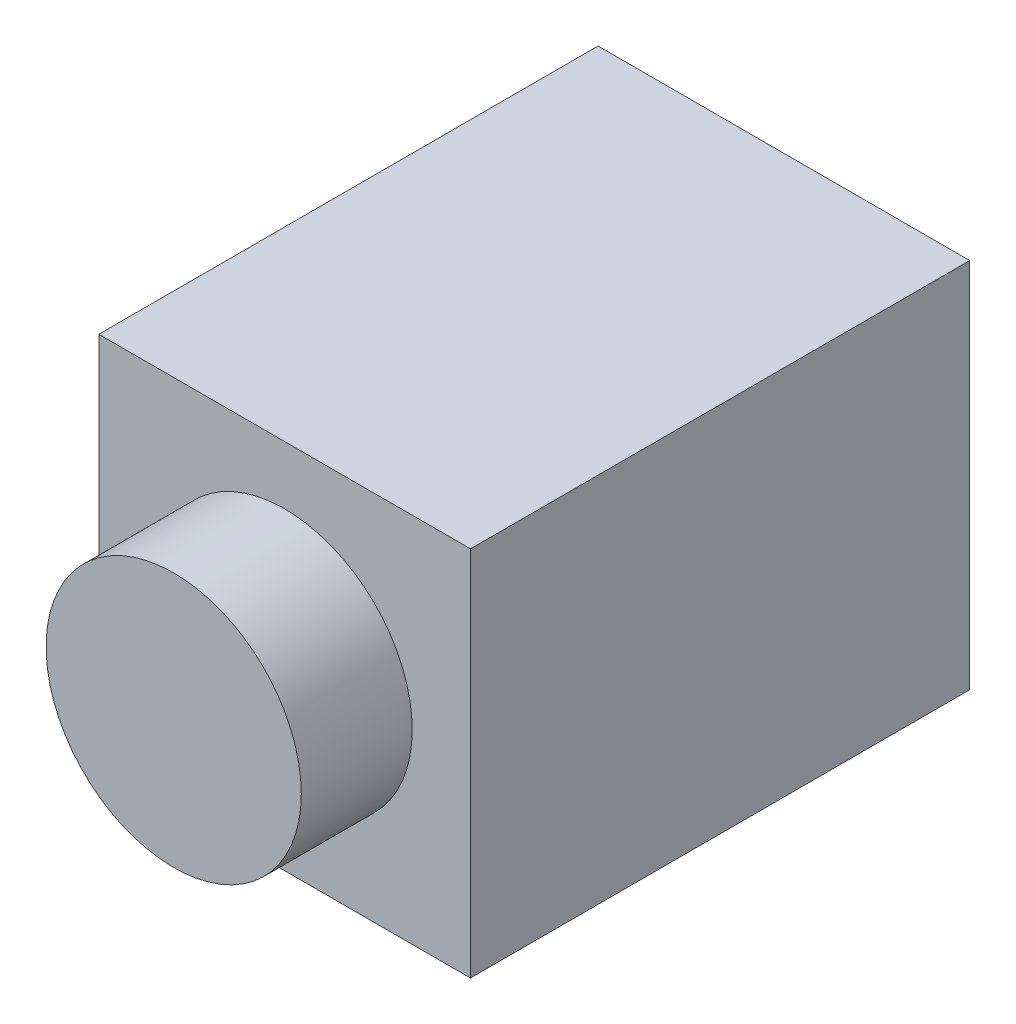
ISO-10303-21;
HEADER;
FILE_DESCRIPTION(('STEP AP214'),'2;1');
FILE_NAME('part.step','',(''),(''),'','','');
FILE_SCHEMA(('AUTOMOTIVE_DESIGN { 1 0 10303 214 1 1 1 1 }'));
ENDSEC;
DATA;
#1=APPLICATION_CONTEXT('core data for automotive mechanical design processes');
#2=APPLICATION_PROTOCOL_DEFINITION('international standard','automotive_design',2000,#1);
#3=PRODUCT_CONTEXT('',#1,'mechanical');
#4=PRODUCT('Part','Part','',(#3));
#5=PRODUCT_RELATED_PRODUCT_CATEGORY('part','',(#4));
#6=PRODUCT_DEFINITION_FORMATION('','',#4);
#7=PRODUCT_DEFINITION_CONTEXT('part definition',#1,'design');
#8=PRODUCT_DEFINITION('design','',#6,#7);
#9=PRODUCT_DEFINITION_SHAPE('','',#8);
#10=(LENGTH_UNIT() NAMED_UNIT(*) SI_UNIT(.MILLI.,.METRE.));
#11=(NAMED_UNIT(*) PLANE_ANGLE_UNIT() SI_UNIT($,.RADIAN.));
#12=(NAMED_UNIT(*) SI_UNIT($,.STERADIAN.) SOLID_ANGLE_UNIT());
#13=UNCERTAINTY_MEASURE_WITH_UNIT(LENGTH_MEASURE(1.E-05),#10,'distance_accuracy_value','');
#14=(GEOMETRIC_REPRESENTATION_CONTEXT(3) GLOBAL_UNCERTAINTY_ASSIGNED_CONTEXT((#13)) GLOBAL_UNIT_ASSIGNED_CONTEXT((#10,
#11,#12)) REPRESENTATION_CONTEXT('',''));
#15=CARTESIAN_POINT('',(0.,0.,0.));
#16=DIRECTION('',(0.,0.,1.));
#17=DIRECTION('',(1.,0.,0.));
#18=AXIS2_PLACEMENT_3D('',#15,#16,#17);
#19=CARTESIAN_POINT('',(33.5,33.5,110.));
#20=DIRECTION('',(0.,0.,-1.));
#21=DIRECTION('',(-1.,0.,0.));
#22=AXIS2_PLACEMENT_3D('',#19,#20,#21);
#23=PLANE('',#22);
#24=CARTESIAN_POINT('',(33.5,33.5,110.));
#25=DIRECTION('',(0.,0.,1.));
#26=DIRECTION('',(1.,0.,0.));
#27=AXIS2_PLACEMENT_3D('',#24,#25,#26);
#28=CIRCLE('',#27,23.);
#29=CARTESIAN_POINT('',(56.5,33.5,110.));
#30=VERTEX_POINT('',#29);
#31=EDGE_CURVE('E69',#30,#30,#28,.F.);
#32=ORIENTED_EDGE('',*,*,#31,.F.);
#33=EDGE_LOOP('',(#32));
#34=FACE_BOUND('',#33,.T.);
#35=ADVANCED_FACE('F17',(#34),#23,.F.);
#36=CARTESIAN_POINT('',(33.5,33.5,90.));
#37=DIRECTION('',(0.,0.,1.));
#38=DIRECTION('',(1.,0.,0.));
#39=AXIS2_PLACEMENT_3D('',#36,#37,#38);
#40=CYLINDRICAL_SURFACE('',#39,23.);
#41=CARTESIAN_POINT('',(33.5,33.5,90.));
#42=DIRECTION('',(0.,0.,1.));
#43=DIRECTION('',(1.,0.,0.));
#44=AXIS2_PLACEMENT_3D('',#41,#42,#43);
#45=CIRCLE('',#44,23.);
#46=CARTESIAN_POINT('',(56.5,33.5,90.));
#47=VERTEX_POINT('',#46);
#48=EDGE_CURVE('E68',#47,#47,#45,.F.);
#49=ORIENTED_EDGE('',*,*,#48,.F.);
#50=EDGE_LOOP('',(#49));
#51=FACE_BOUND('',#50,.T.);
#52=ORIENTED_EDGE('',*,*,#31,.T.);
#53=EDGE_LOOP('',(#52));
#54=FACE_BOUND('',#53,.T.);
#55=ADVANCED_FACE('F89',(#51,#54),#40,.T.);
#56=CARTESIAN_POINT('',(67.,67.,0.));
#57=DIRECTION('',(1.,0.,0.));
#58=DIRECTION('',(0.,0.,-1.));
#59=AXIS2_PLACEMENT_3D('',#56,#57,#58);
#60=PLANE('',#59);
#61=DIRECTION('',(0.,1.,0.));
#62=VECTOR('',#61,1.);
#63=CARTESIAN_POINT('',(67.,33.5,0.));
#64=LINE('',#63,#62);
#65=CARTESIAN_POINT('',(67.,0.,0.));
#66=VERTEX_POINT('',#65);
#67=CARTESIAN_POINT('',(67.,67.,0.));
#68=VERTEX_POINT('',#67);
#69=EDGE_CURVE('E55',#66,#68,#64,.T.);
#70=ORIENTED_EDGE('',*,*,#69,.T.);
#71=DIRECTION('',(0.,0.,1.));
#72=VECTOR('',#71,1.);
#73=CARTESIAN_POINT('',(67.,67.,0.));
#74=LINE('',#73,#72);
#75=CARTESIAN_POINT('',(67.,67.,90.));
#76=VERTEX_POINT('',#75);
#77=EDGE_CURVE('E71',#76,#68,#74,.F.);
#78=ORIENTED_EDGE('',*,*,#77,.F.);
#79=DIRECTION('',(0.,1.,0.));
#80=VECTOR('',#79,1.);
#81=CARTESIAN_POINT('',(67.,33.5,90.));
#82=LINE('',#81,#80);
#83=CARTESIAN_POINT('',(67.,0.,90.));
#84=VERTEX_POINT('',#83);
#85=EDGE_CURVE('E60',#84,#76,#82,.T.);
#86=ORIENTED_EDGE('',*,*,#85,.F.);
#87=DIRECTION('',(0.,0.,-1.));
#88=VECTOR('',#87,1.);
#89=CARTESIAN_POINT('',(67.,0.,0.));
#90=LINE('',#89,#88);
#91=EDGE_CURVE('E174',#66,#84,#90,.F.);
#92=ORIENTED_EDGE('',*,*,#91,.F.);
#93=EDGE_LOOP('',(#70,#78,#86,#92));
#94=FACE_BOUND('',#93,.T.);
#95=ADVANCED_FACE('F72',(#94),#60,.T.);
#96=CARTESIAN_POINT('',(33.5,33.5,90.));
#97=DIRECTION('',(0.,0.,1.));
#98=DIRECTION('',(1.,0.,0.));
#99=AXIS2_PLACEMENT_3D('',#96,#97,#98);
#100=PLANE('',#99);
#101=ORIENTED_EDGE('',*,*,#48,.T.);
#102=EDGE_LOOP('',(#101));
#103=FACE_BOUND('',#102,.T.);
#104=ORIENTED_EDGE('',*,*,#85,.T.);
#105=DIRECTION('',(1.,0.,0.));
#106=VECTOR('',#105,1.);
#107=CARTESIAN_POINT('',(0.,67.,90.));
#108=LINE('',#107,#106);
#109=CARTESIAN_POINT('',(0.,67.,90.));
#110=VERTEX_POINT('',#109);
#111=EDGE_CURVE('E63',#110,#76,#108,.T.);
#112=ORIENTED_EDGE('',*,*,#111,.F.);
#113=DIRECTION('',(0.,1.,0.));
#114=VECTOR('',#113,1.);
#115=CARTESIAN_POINT('',(0.,0.,90.));
#116=LINE('',#115,#114);
#117=CARTESIAN_POINT('',(0.,0.,90.));
#118=VERTEX_POINT('',#117);
#119=EDGE_CURVE('E172',#118,#110,#116,.T.);
#120=ORIENTED_EDGE('',*,*,#119,.F.);
#121=DIRECTION('',(1.,0.,0.));
#122=VECTOR('',#121,1.);
#123=CARTESIAN_POINT('',(67.,0.,90.));
#124=LINE('',#123,#122);
#125=EDGE_CURVE('E66',#84,#118,#124,.F.);
#126=ORIENTED_EDGE('',*,*,#125,.F.);
#127=EDGE_LOOP('',(#104,#112,#120,#126));
#128=FACE_BOUND('',#127,.T.);
#129=ADVANCED_FACE('F61',(#103,#128),#100,.T.);
#130=CARTESIAN_POINT('',(0.,67.,0.));
#131=DIRECTION('',(0.,1.,0.));
#132=DIRECTION('',(0.,0.,1.));
#133=AXIS2_PLACEMENT_3D('',#130,#131,#132);
#134=PLANE('',#133);
#135=DIRECTION('',(1.,0.,0.));
#136=VECTOR('',#135,1.);
#137=CARTESIAN_POINT('',(33.5,67.,0.));
#138=LINE('',#137,#136);
#139=CARTESIAN_POINT('',(0.,67.,0.));
#140=VERTEX_POINT('',#139);
#141=EDGE_CURVE('E170',#68,#140,#138,.F.);
#142=ORIENTED_EDGE('',*,*,#141,.T.);
#143=DIRECTION('',(0.,0.,1.));
#144=VECTOR('',#143,1.);
#145=CARTESIAN_POINT('',(0.,67.,0.));
#146=LINE('',#145,#144);
#147=EDGE_CURVE('E78',#110,#140,#146,.F.);
#148=ORIENTED_EDGE('',*,*,#147,.F.);
#149=ORIENTED_EDGE('',*,*,#111,.T.);
#150=ORIENTED_EDGE('',*,*,#77,.T.);
#151=EDGE_LOOP('',(#142,#148,#149,#150));
#152=FACE_BOUND('',#151,.T.);
#153=ADVANCED_FACE('F76',(#152),#134,.T.);
#154=CARTESIAN_POINT('',(33.5,33.5,0.));
#155=DIRECTION('',(0.,0.,1.));
#156=DIRECTION('',(1.,0.,0.));
#157=AXIS2_PLACEMENT_3D('',#154,#155,#156);
#158=PLANE('',#157);
#159=DIRECTION('',(0.,1.,0.));
#160=VECTOR('',#159,1.);
#161=CARTESIAN_POINT('',(0.,0.,0.));
#162=LINE('',#161,#160);
#163=CARTESIAN_POINT('',(0.,0.,0.));
#164=VERTEX_POINT('',#163);
#165=EDGE_CURVE('E26',#140,#164,#162,.F.);
#166=ORIENTED_EDGE('',*,*,#165,.F.);
#167=ORIENTED_EDGE('',*,*,#141,.F.);
#168=ORIENTED_EDGE('',*,*,#69,.F.);
#169=DIRECTION('',(1.,0.,0.));
#170=VECTOR('',#169,1.);
#171=CARTESIAN_POINT('',(67.,0.,0.));
#172=LINE('',#171,#170);
#173=EDGE_CURVE('E35',#164,#66,#172,.T.);
#174=ORIENTED_EDGE('',*,*,#173,.F.);
#175=EDGE_LOOP('',(#166,#167,#168,#174));
#176=FACE_BOUND('',#175,.T.);
#177=ADVANCED_FACE('F105',(#176),#158,.F.);
#178=CARTESIAN_POINT('',(67.,0.,0.));
#179=DIRECTION('',(0.,-1.,0.));
#180=DIRECTION('',(0.,0.,-1.));
#181=AXIS2_PLACEMENT_3D('',#178,#179,#180);
#182=PLANE('',#181);
#183=ORIENTED_EDGE('',*,*,#173,.T.);
#184=ORIENTED_EDGE('',*,*,#91,.T.);
#185=ORIENTED_EDGE('',*,*,#125,.T.);
#186=DIRECTION('',(0.,0.,1.));
#187=VECTOR('',#186,1.);
#188=CARTESIAN_POINT('',(0.,0.,0.));
#189=LINE('',#188,#187);
#190=EDGE_CURVE('E11',#164,#118,#189,.T.);
#191=ORIENTED_EDGE('',*,*,#190,.F.);
#192=EDGE_LOOP('',(#183,#184,#185,#191));
#193=FACE_BOUND('',#192,.T.);
#194=ADVANCED_FACE('F99',(#193),#182,.T.);
#195=CARTESIAN_POINT('',(0.,0.,0.));
#196=DIRECTION('',(-1.,0.,0.));
#197=DIRECTION('',(0.,0.,1.));
#198=AXIS2_PLACEMENT_3D('',#195,#196,#197);
#199=PLANE('',#198);
#200=ORIENTED_EDGE('',*,*,#165,.T.);
#201=ORIENTED_EDGE('',*,*,#190,.T.);
#202=ORIENTED_EDGE('',*,*,#119,.T.);
#203=ORIENTED_EDGE('',*,*,#147,.T.);
#204=EDGE_LOOP('',(#200,#201,#202,#203));
#205=FACE_BOUND('',#204,.T.);
#206=ADVANCED_FACE('F97',(#205),#199,.T.);
#207=CLOSED_SHELL('',(#35,#55,#95,#129,#153,#177,#194,#206));
#208=MANIFOLD_SOLID_BREP('B1',#207);
#209=ADVANCED_BREP_SHAPE_REPRESENTATION('',(#18,#208),#14);
#210=SHAPE_DEFINITION_REPRESENTATION(#9,#209);
ENDSEC;
END-ISO-10303-21;
